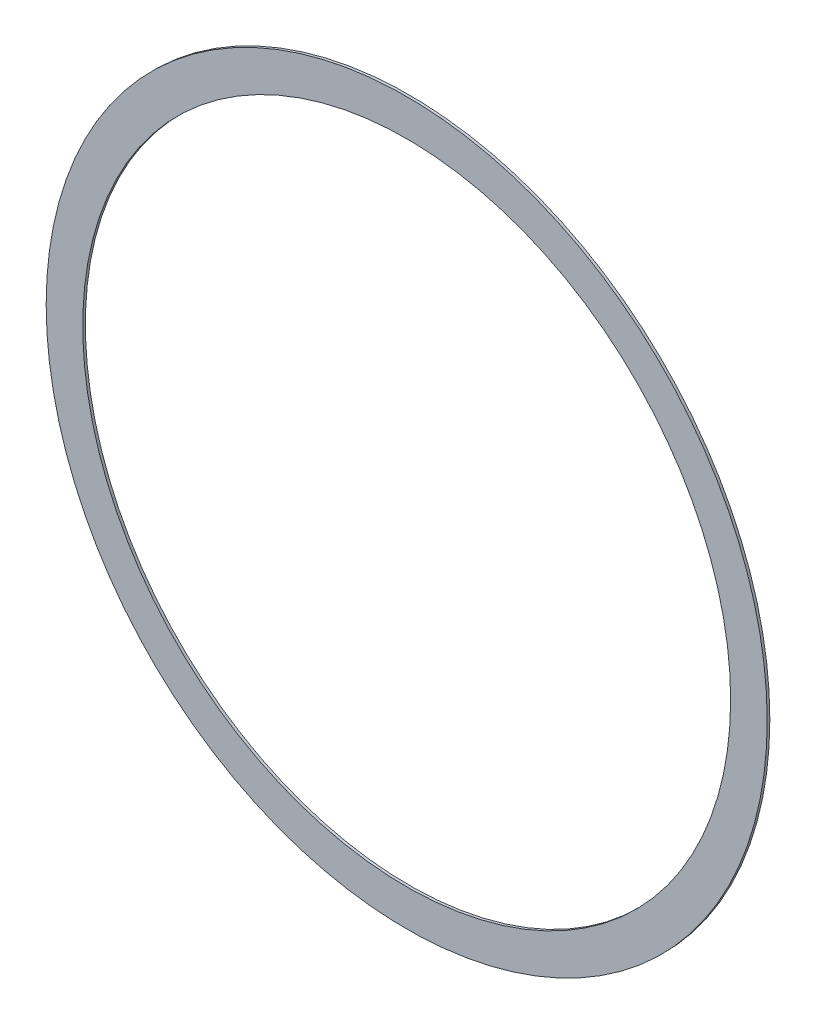
ISO-10303-21;
HEADER;
FILE_DESCRIPTION(('STEP AP214'),'2;1');
FILE_NAME('part.step','',(''),(''),'','','');
FILE_SCHEMA(('AUTOMOTIVE_DESIGN { 1 0 10303 214 1 1 1 1 }'));
ENDSEC;
DATA;
#1=APPLICATION_CONTEXT('core data for automotive mechanical design processes');
#2=APPLICATION_PROTOCOL_DEFINITION('international standard','automotive_design',2000,#1);
#3=PRODUCT_CONTEXT('',#1,'mechanical');
#4=PRODUCT('Part','Part','',(#3));
#5=PRODUCT_RELATED_PRODUCT_CATEGORY('part','',(#4));
#6=PRODUCT_DEFINITION_FORMATION('','',#4);
#7=PRODUCT_DEFINITION_CONTEXT('part definition',#1,'design');
#8=PRODUCT_DEFINITION('design','',#6,#7);
#9=PRODUCT_DEFINITION_SHAPE('','',#8);
#10=(LENGTH_UNIT() NAMED_UNIT(*) SI_UNIT(.MILLI.,.METRE.));
#11=(NAMED_UNIT(*) PLANE_ANGLE_UNIT() SI_UNIT($,.RADIAN.));
#12=(NAMED_UNIT(*) SI_UNIT($,.STERADIAN.) SOLID_ANGLE_UNIT());
#13=UNCERTAINTY_MEASURE_WITH_UNIT(LENGTH_MEASURE(1.E-05),#10,'distance_accuracy_value','');
#14=(GEOMETRIC_REPRESENTATION_CONTEXT(3) GLOBAL_UNCERTAINTY_ASSIGNED_CONTEXT((#13)) GLOBAL_UNIT_ASSIGNED_CONTEXT((#10,
#11,#12)) REPRESENTATION_CONTEXT('',''));
#15=CARTESIAN_POINT('',(0.,0.,0.));
#16=DIRECTION('',(0.,0.,1.));
#17=DIRECTION('',(1.,0.,0.));
#18=AXIS2_PLACEMENT_3D('',#15,#16,#17);
#19=CARTESIAN_POINT('',(0.,0.,0.5));
#20=DIRECTION('',(0.,0.,1.));
#21=DIRECTION('',(1.,0.,0.));
#22=AXIS2_PLACEMENT_3D('',#19,#20,#21);
#23=PLANE('',#22);
#24=CARTESIAN_POINT('',(0.,0.,0.5));
#25=DIRECTION('',(0.,0.,1.));
#26=DIRECTION('',(1.,0.,0.));
#27=AXIS2_PLACEMENT_3D('',#24,#25,#26);
#28=CIRCLE('',#27,69.);
#29=CARTESIAN_POINT('',(69.,0.,0.5));
#30=VERTEX_POINT('',#29);
#31=EDGE_CURVE('E10',#30,#30,#28,.T.);
#32=ORIENTED_EDGE('',*,*,#31,.T.);
#33=EDGE_LOOP('',(#32));
#34=FACE_BOUND('',#33,.T.);
#35=CARTESIAN_POINT('',(0.,0.,0.5));
#36=DIRECTION('',(0.,0.,1.));
#37=DIRECTION('',(1.,0.,0.));
#38=AXIS2_PLACEMENT_3D('',#35,#36,#37);
#39=CIRCLE('',#38,62.);
#40=CARTESIAN_POINT('',(62.,0.,0.5));
#41=VERTEX_POINT('',#40);
#42=EDGE_CURVE('E48',#41,#41,#39,.T.);
#43=ORIENTED_EDGE('',*,*,#42,.F.);
#44=EDGE_LOOP('',(#43));
#45=FACE_BOUND('',#44,.T.);
#46=ADVANCED_FACE('F37',(#34,#45),#23,.T.);
#47=CARTESIAN_POINT('',(0.,0.,0.));
#48=DIRECTION('',(0.,0.,1.));
#49=DIRECTION('',(1.,0.,0.));
#50=AXIS2_PLACEMENT_3D('',#47,#48,#49);
#51=PLANE('',#50);
#52=CARTESIAN_POINT('',(0.,0.,0.));
#53=DIRECTION('',(0.,0.,1.));
#54=DIRECTION('',(1.,0.,0.));
#55=AXIS2_PLACEMENT_3D('',#52,#53,#54);
#56=CIRCLE('',#55,69.);
#57=CARTESIAN_POINT('',(69.,0.,0.));
#58=VERTEX_POINT('',#57);
#59=EDGE_CURVE('E41',#58,#58,#56,.T.);
#60=ORIENTED_EDGE('',*,*,#59,.F.);
#61=EDGE_LOOP('',(#60));
#62=FACE_BOUND('',#61,.T.);
#63=CARTESIAN_POINT('',(0.,0.,0.));
#64=DIRECTION('',(0.,0.,1.));
#65=DIRECTION('',(1.,0.,0.));
#66=AXIS2_PLACEMENT_3D('',#63,#64,#65);
#67=CIRCLE('',#66,62.);
#68=CARTESIAN_POINT('',(62.,0.,0.));
#69=VERTEX_POINT('',#68);
#70=EDGE_CURVE('E50',#69,#69,#67,.T.);
#71=ORIENTED_EDGE('',*,*,#70,.T.);
#72=EDGE_LOOP('',(#71));
#73=FACE_BOUND('',#72,.T.);
#74=ADVANCED_FACE('F60',(#62,#73),#51,.F.);
#75=CARTESIAN_POINT('',(0.,0.,0.5));
#76=DIRECTION('',(0.,0.,-1.));
#77=DIRECTION('',(-1.,0.,0.));
#78=AXIS2_PLACEMENT_3D('',#75,#76,#77);
#79=CYLINDRICAL_SURFACE('',#78,69.);
#80=ORIENTED_EDGE('',*,*,#31,.F.);
#81=EDGE_LOOP('',(#80));
#82=FACE_BOUND('',#81,.T.);
#83=ORIENTED_EDGE('',*,*,#59,.T.);
#84=EDGE_LOOP('',(#83));
#85=FACE_BOUND('',#84,.T.);
#86=ADVANCED_FACE('F39',(#82,#85),#79,.T.);
#87=CARTESIAN_POINT('',(0.,0.,0.5));
#88=DIRECTION('',(0.,0.,-1.));
#89=DIRECTION('',(-1.,0.,0.));
#90=AXIS2_PLACEMENT_3D('',#87,#88,#89);
#91=CYLINDRICAL_SURFACE('',#90,62.);
#92=ORIENTED_EDGE('',*,*,#42,.T.);
#93=EDGE_LOOP('',(#92));
#94=FACE_BOUND('',#93,.T.);
#95=ORIENTED_EDGE('',*,*,#70,.F.);
#96=EDGE_LOOP('',(#95));
#97=FACE_BOUND('',#96,.T.);
#98=ADVANCED_FACE('F56',(#94,#97),#91,.F.);
#99=CLOSED_SHELL('',(#46,#74,#86,#98));
#100=MANIFOLD_SOLID_BREP('B2',#99);
#101=ADVANCED_BREP_SHAPE_REPRESENTATION('',(#18,#100),#14);
#102=SHAPE_DEFINITION_REPRESENTATION(#9,#101);
ENDSEC;
END-ISO-10303-21;
